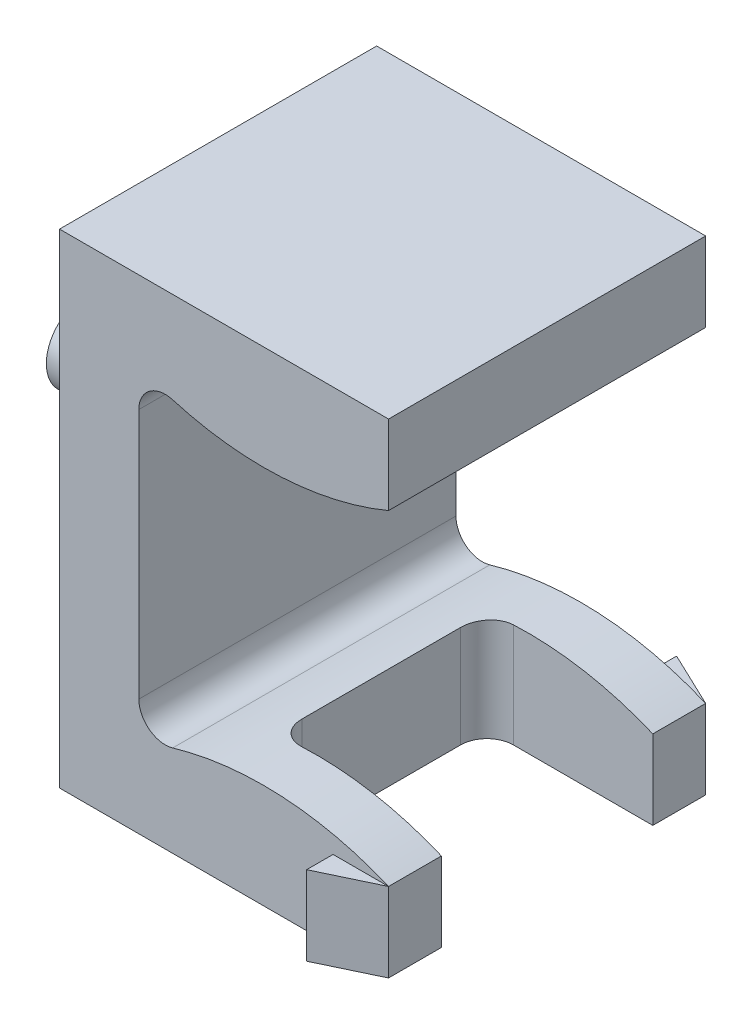
ISO-10303-21;
HEADER;
FILE_DESCRIPTION(('STEP AP214'),'2;1');
FILE_NAME('part.step','',(''),(''),'','','');
FILE_SCHEMA(('AUTOMOTIVE_DESIGN { 1 0 10303 214 1 1 1 1 }'));
ENDSEC;
DATA;
#1=APPLICATION_CONTEXT('core data for automotive mechanical design processes');
#2=APPLICATION_PROTOCOL_DEFINITION('international standard','automotive_design',2000,#1);
#3=PRODUCT_CONTEXT('',#1,'mechanical');
#4=PRODUCT('Part','Part','',(#3));
#5=PRODUCT_RELATED_PRODUCT_CATEGORY('part','',(#4));
#6=PRODUCT_DEFINITION_FORMATION('','',#4);
#7=PRODUCT_DEFINITION_CONTEXT('part definition',#1,'design');
#8=PRODUCT_DEFINITION('design','',#6,#7);
#9=PRODUCT_DEFINITION_SHAPE('','',#8);
#10=(LENGTH_UNIT() NAMED_UNIT(*) SI_UNIT(.MILLI.,.METRE.));
#11=(NAMED_UNIT(*) PLANE_ANGLE_UNIT() SI_UNIT($,.RADIAN.));
#12=(NAMED_UNIT(*) SI_UNIT($,.STERADIAN.) SOLID_ANGLE_UNIT());
#13=UNCERTAINTY_MEASURE_WITH_UNIT(LENGTH_MEASURE(1.E-05),#10,'distance_accuracy_value','');
#14=(GEOMETRIC_REPRESENTATION_CONTEXT(3) GLOBAL_UNCERTAINTY_ASSIGNED_CONTEXT((#13)) GLOBAL_UNIT_ASSIGNED_CONTEXT((#10,
#11,#12)) REPRESENTATION_CONTEXT('',''));
#15=CARTESIAN_POINT('',(0.,0.,0.));
#16=DIRECTION('',(0.,0.,1.));
#17=DIRECTION('',(1.,0.,0.));
#18=AXIS2_PLACEMENT_3D('',#15,#16,#17);
#19=CARTESIAN_POINT('',(-159.798174106342,-6.159375,6.));
#20=DIRECTION('',(-1.,0.,0.));
#21=DIRECTION('',(0.,-1.,0.));
#22=AXIS2_PLACEMENT_3D('',#19,#20,#21);
#23=PLANE('',#22);
#24=DIRECTION('',(0.,0.,-1.));
#25=VECTOR('',#24,1.);
#26=CARTESIAN_POINT('',(-159.798174106342,-9.159375,6.));
#27=LINE('',#26,#25);
#28=CARTESIAN_POINT('',(-159.798174106342,-9.159375,6.));
#29=VERTEX_POINT('',#28);
#30=CARTESIAN_POINT('',(-159.798174106342,-9.159375,4.));
#31=VERTEX_POINT('',#30);
#32=EDGE_CURVE('E199',#29,#31,#27,.T.);
#33=ORIENTED_EDGE('',*,*,#32,.T.);
#34=DIRECTION('',(0.,-1.,0.));
#35=VECTOR('',#34,1.);
#36=CARTESIAN_POINT('',(-159.798174106342,9.16037500000001,4.));
#37=LINE('',#36,#35);
#38=CARTESIAN_POINT('',(-159.798174106342,-6.159375,4.));
#39=VERTEX_POINT('',#38);
#40=EDGE_CURVE('E191',#39,#31,#37,.T.);
#41=ORIENTED_EDGE('',*,*,#40,.F.);
#42=DIRECTION('',(0.,0.,-1.));
#43=VECTOR('',#42,1.);
#44=CARTESIAN_POINT('',(-159.798174106342,-6.159375,6.));
#45=LINE('',#44,#43);
#46=CARTESIAN_POINT('',(-159.798174106342,-6.159375,6.));
#47=VERTEX_POINT('',#46);
#48=EDGE_CURVE('E200',#47,#39,#45,.T.);
#49=ORIENTED_EDGE('',*,*,#48,.F.);
#50=DIRECTION('',(0.,1.,0.));
#51=VECTOR('',#50,1.);
#52=CARTESIAN_POINT('',(-159.798174106342,-6.159375,6.));
#53=LINE('',#52,#51);
#54=EDGE_CURVE('E369',#29,#47,#53,.T.);
#55=ORIENTED_EDGE('',*,*,#54,.F.);
#56=EDGE_LOOP('',(#33,#41,#49,#55));
#57=FACE_BOUND('',#56,.T.);
#58=ADVANCED_FACE('F33',(#57),#23,.F.);
#59=CARTESIAN_POINT('',(-164.523174106342,17.4347039473684,6.));
#60=DIRECTION('',(0.,0.,-1.));
#61=DIRECTION('',(-1.,0.,0.));
#62=AXIS2_PLACEMENT_3D('',#59,#60,#61);
#63=CYLINDRICAL_SURFACE('',#62,12.2253289473684);
#64=CARTESIAN_POINT('',(-164.523174106342,17.4347039473684,6.));
#65=DIRECTION('',(0.,0.,1.));
#66=DIRECTION('',(1.,0.,0.));
#67=AXIS2_PLACEMENT_3D('',#64,#65,#66);
#68=CIRCLE('',#67,12.2253289473684);
#69=CARTESIAN_POINT('',(-167.966517595958,5.70431377977871,6.));
#70=VERTEX_POINT('',#69);
#71=CARTESIAN_POINT('',(-159.798174106342,6.159375,6.));
#72=VERTEX_POINT('',#71);
#73=EDGE_CURVE('E353',#70,#72,#68,.T.);
#74=ORIENTED_EDGE('',*,*,#73,.F.);
#75=DIRECTION('',(0.,0.,-1.));
#76=VECTOR('',#75,1.);
#77=CARTESIAN_POINT('',(-167.966517595958,5.70431377977872,6.));
#78=LINE('',#77,#76);
#79=CARTESIAN_POINT('',(-167.966517595958,5.70431377977871,-6.));
#80=VERTEX_POINT('',#79);
#81=EDGE_CURVE('E270',#70,#80,#78,.T.);
#82=ORIENTED_EDGE('',*,*,#81,.T.);
#83=CARTESIAN_POINT('',(-164.523174106342,17.4347039473684,-6.));
#84=DIRECTION('',(0.,0.,1.));
#85=DIRECTION('',(1.,0.,0.));
#86=AXIS2_PLACEMENT_3D('',#83,#84,#85);
#87=CIRCLE('',#86,12.2253289473684);
#88=CARTESIAN_POINT('',(-159.798174106342,6.159375,-6.));
#89=VERTEX_POINT('',#88);
#90=EDGE_CURVE('E331',#80,#89,#87,.T.);
#91=ORIENTED_EDGE('',*,*,#90,.T.);
#92=DIRECTION('',(0.,0.,-1.));
#93=VECTOR('',#92,1.);
#94=CARTESIAN_POINT('',(-159.798174106342,6.159375,6.));
#95=LINE('',#94,#93);
#96=EDGE_CURVE('E216',#72,#89,#95,.T.);
#97=ORIENTED_EDGE('',*,*,#96,.F.);
#98=EDGE_LOOP('',(#74,#82,#91,#97));
#99=FACE_BOUND('',#98,.T.);
#100=ADVANCED_FACE('F250',(#99),#63,.T.);
#101=CARTESIAN_POINT('',(-159.798174106342,6.159375,6.));
#102=DIRECTION('',(-1.,0.,0.));
#103=DIRECTION('',(0.,-1.,0.));
#104=AXIS2_PLACEMENT_3D('',#101,#102,#103);
#105=PLANE('',#104);
#106=DIRECTION('',(0.,1.,0.));
#107=VECTOR('',#106,1.);
#108=CARTESIAN_POINT('',(-159.798174106342,6.159375,-6.));
#109=LINE('',#108,#107);
#110=CARTESIAN_POINT('',(-159.798174106342,9.159375,-6.));
#111=VERTEX_POINT('',#110);
#112=EDGE_CURVE('E323',#89,#111,#109,.T.);
#113=ORIENTED_EDGE('',*,*,#112,.T.);
#114=DIRECTION('',(0.,0.,-1.));
#115=VECTOR('',#114,1.);
#116=CARTESIAN_POINT('',(-159.798174106342,9.159375,6.));
#117=LINE('',#116,#115);
#118=CARTESIAN_POINT('',(-159.798174106342,9.159375,6.));
#119=VERTEX_POINT('',#118);
#120=EDGE_CURVE('E213',#119,#111,#117,.T.);
#121=ORIENTED_EDGE('',*,*,#120,.F.);
#122=DIRECTION('',(0.,1.,0.));
#123=VECTOR('',#122,1.);
#124=CARTESIAN_POINT('',(-159.798174106342,6.159375,6.));
#125=LINE('',#124,#123);
#126=EDGE_CURVE('E356',#72,#119,#125,.T.);
#127=ORIENTED_EDGE('',*,*,#126,.F.);
#128=ORIENTED_EDGE('',*,*,#96,.T.);
#129=EDGE_LOOP('',(#113,#121,#127,#128));
#130=FACE_BOUND('',#129,.T.);
#131=ADVANCED_FACE('F297',(#130),#105,.F.);
#132=CARTESIAN_POINT('',(-159.798174106342,9.159375,6.));
#133=DIRECTION('',(0.,-1.,0.));
#134=DIRECTION('',(1.,0.,0.));
#135=AXIS2_PLACEMENT_3D('',#132,#133,#134);
#136=PLANE('',#135);
#137=DIRECTION('',(-1.,0.,0.));
#138=VECTOR('',#137,1.);
#139=CARTESIAN_POINT('',(-159.798174106342,9.159375,-6.));
#140=LINE('',#139,#138);
#141=CARTESIAN_POINT('',(-172.248174106342,9.159375,-6.));
#142=VERTEX_POINT('',#141);
#143=EDGE_CURVE('E330',#111,#142,#140,.T.);
#144=ORIENTED_EDGE('',*,*,#143,.T.);
#145=DIRECTION('',(0.,0.,-1.));
#146=VECTOR('',#145,1.);
#147=CARTESIAN_POINT('',(-172.248174106342,9.159375,6.));
#148=LINE('',#147,#146);
#149=CARTESIAN_POINT('',(-172.248174106342,9.159375,6.));
#150=VERTEX_POINT('',#149);
#151=EDGE_CURVE('E210',#150,#142,#148,.T.);
#152=ORIENTED_EDGE('',*,*,#151,.F.);
#153=DIRECTION('',(-1.,0.,0.));
#154=VECTOR('',#153,1.);
#155=CARTESIAN_POINT('',(-159.798174106342,9.159375,6.));
#156=LINE('',#155,#154);
#157=EDGE_CURVE('E334',#119,#150,#156,.T.);
#158=ORIENTED_EDGE('',*,*,#157,.F.);
#159=ORIENTED_EDGE('',*,*,#120,.T.);
#160=EDGE_LOOP('',(#144,#152,#158,#159));
#161=FACE_BOUND('',#160,.T.);
#162=ADVANCED_FACE('F311',(#161),#136,.F.);
#163=CARTESIAN_POINT('',(-172.248174106342,9.159375,6.));
#164=DIRECTION('',(1.,0.,0.));
#165=DIRECTION('',(0.,0.,-1.));
#166=AXIS2_PLACEMENT_3D('',#163,#164,#165);
#167=PLANE('',#166);
#168=CARTESIAN_POINT('',(-172.248174106342,0.,0.));
#169=DIRECTION('',(1.,0.,0.));
#170=DIRECTION('',(0.,0.,-1.));
#171=AXIS2_PLACEMENT_3D('',#168,#169,#170);
#172=CIRCLE('',#171,2.5);
#173=CARTESIAN_POINT('',(-172.248174106342,0.,-2.5));
#174=VERTEX_POINT('',#173);
#175=EDGE_CURVE('E11',#174,#174,#172,.T.);
#176=ORIENTED_EDGE('',*,*,#175,.T.);
#177=EDGE_LOOP('',(#176));
#178=FACE_BOUND('',#177,.T.);
#179=DIRECTION('',(0.,-1.,0.));
#180=VECTOR('',#179,1.);
#181=CARTESIAN_POINT('',(-172.248174106342,9.159375,-6.));
#182=LINE('',#181,#180);
#183=CARTESIAN_POINT('',(-172.248174106342,-9.159375,-6.));
#184=VERTEX_POINT('',#183);
#185=EDGE_CURVE('E339',#142,#184,#182,.T.);
#186=ORIENTED_EDGE('',*,*,#185,.T.);
#187=DIRECTION('',(0.,0.,-1.));
#188=VECTOR('',#187,1.);
#189=CARTESIAN_POINT('',(-172.248174106342,-9.159375,6.));
#190=LINE('',#189,#188);
#191=CARTESIAN_POINT('',(-172.248174106342,-9.159375,6.));
#192=VERTEX_POINT('',#191);
#193=EDGE_CURVE('E203',#192,#184,#190,.T.);
#194=ORIENTED_EDGE('',*,*,#193,.F.);
#195=DIRECTION('',(0.,-1.,0.));
#196=VECTOR('',#195,1.);
#197=CARTESIAN_POINT('',(-172.248174106342,9.159375,6.));
#198=LINE('',#197,#196);
#199=EDGE_CURVE('E364',#150,#192,#198,.T.);
#200=ORIENTED_EDGE('',*,*,#199,.F.);
#201=ORIENTED_EDGE('',*,*,#151,.T.);
#202=EDGE_LOOP('',(#186,#194,#200,#201));
#203=FACE_BOUND('',#202,.T.);
#204=ADVANCED_FACE('F307',(#178,#203),#167,.F.);
#205=CARTESIAN_POINT('',(-159.798174106342,-9.159375,6.));
#206=DIRECTION('',(0.,1.,0.));
#207=DIRECTION('',(-1.,0.,0.));
#208=AXIS2_PLACEMENT_3D('',#205,#206,#207);
#209=PLANE('',#208);
#210=DIRECTION('',(0.,0.,-1.));
#211=VECTOR('',#210,1.);
#212=CARTESIAN_POINT('',(-166.073174106342,-9.159375,4.));
#213=LINE('',#212,#211);
#214=CARTESIAN_POINT('',(-166.073174106342,-9.159375,3.));
#215=VERTEX_POINT('',#214);
#216=CARTESIAN_POINT('',(-166.073174106342,-9.159375,-3.));
#217=VERTEX_POINT('',#216);
#218=EDGE_CURVE('E182',#215,#217,#213,.T.);
#219=ORIENTED_EDGE('',*,*,#218,.F.);
#220=CARTESIAN_POINT('',(-165.073174106342,-9.159375,3.));
#221=DIRECTION('',(0.,1.,0.));
#222=DIRECTION('',(-1.,0.,0.));
#223=AXIS2_PLACEMENT_3D('',#220,#221,#222);
#224=CIRCLE('',#223,1.);
#225=CARTESIAN_POINT('',(-165.073174106342,-9.159375,4.));
#226=VERTEX_POINT('',#225);
#227=EDGE_CURVE('E237',#215,#226,#224,.T.);
#228=ORIENTED_EDGE('',*,*,#227,.T.);
#229=DIRECTION('',(-1.,0.,0.));
#230=VECTOR('',#229,1.);
#231=CARTESIAN_POINT('',(-159.798174106342,-9.159375,4.));
#232=LINE('',#231,#230);
#233=EDGE_CURVE('E419',#31,#226,#232,.T.);
#234=ORIENTED_EDGE('',*,*,#233,.F.);
#235=ORIENTED_EDGE('',*,*,#32,.F.);
#236=DIRECTION('',(-0.902860518823943,0.,0.429933580392322));
#237=VECTOR('',#236,1.);
#238=CARTESIAN_POINT('',(-159.798174106342,-9.159375,6.));
#239=LINE('',#238,#237);
#240=CARTESIAN_POINT('',(-161.898174106342,-9.159375,7.));
#241=VERTEX_POINT('',#240);
#242=EDGE_CURVE('E397',#29,#241,#239,.T.);
#243=ORIENTED_EDGE('',*,*,#242,.T.);
#244=DIRECTION('',(0.,0.,-1.));
#245=VECTOR('',#244,1.);
#246=CARTESIAN_POINT('',(-161.898174106342,-9.159375,7.));
#247=LINE('',#246,#245);
#248=CARTESIAN_POINT('',(-161.898174106342,-9.159375,6.));
#249=VERTEX_POINT('',#248);
#250=EDGE_CURVE('E401',#241,#249,#247,.T.);
#251=ORIENTED_EDGE('',*,*,#250,.T.);
#252=DIRECTION('',(1.,0.,0.));
#253=VECTOR('',#252,1.);
#254=CARTESIAN_POINT('',(-159.798174106342,-9.159375,6.));
#255=LINE('',#254,#253);
#256=EDGE_CURVE('E366',#192,#249,#255,.T.);
#257=ORIENTED_EDGE('',*,*,#256,.F.);
#258=ORIENTED_EDGE('',*,*,#193,.T.);
#259=DIRECTION('',(1.,0.,0.));
#260=VECTOR('',#259,1.);
#261=CARTESIAN_POINT('',(-159.798174106342,-9.159375,-6.));
#262=LINE('',#261,#260);
#263=CARTESIAN_POINT('',(-161.898174106342,-9.159375,-6.));
#264=VERTEX_POINT('',#263);
#265=EDGE_CURVE('E341',#184,#264,#262,.T.);
#266=ORIENTED_EDGE('',*,*,#265,.T.);
#267=DIRECTION('',(0.,0.,-1.));
#268=VECTOR('',#267,1.);
#269=CARTESIAN_POINT('',(-161.898174106342,-9.159375,-7.));
#270=LINE('',#269,#268);
#271=CARTESIAN_POINT('',(-161.898174106342,-9.159375,-7.));
#272=VERTEX_POINT('',#271);
#273=EDGE_CURVE('E384',#264,#272,#270,.T.);
#274=ORIENTED_EDGE('',*,*,#273,.T.);
#275=DIRECTION('',(0.902860518823943,0.,0.429933580392322));
#276=VECTOR('',#275,1.);
#277=CARTESIAN_POINT('',(-159.798174106342,-9.159375,-6.));
#278=LINE('',#277,#276);
#279=CARTESIAN_POINT('',(-159.798174106342,-9.159375,-6.));
#280=VERTEX_POINT('',#279);
#281=EDGE_CURVE('E198',#272,#280,#278,.T.);
#282=ORIENTED_EDGE('',*,*,#281,.T.);
#283=CARTESIAN_POINT('',(-159.798174106342,-9.159375,-4.));
#284=VERTEX_POINT('',#283);
#285=EDGE_CURVE('E188',#284,#280,#27,.T.);
#286=ORIENTED_EDGE('',*,*,#285,.F.);
#287=DIRECTION('',(1.,0.,0.));
#288=VECTOR('',#287,1.);
#289=CARTESIAN_POINT('',(-159.798174106342,-9.159375,-4.));
#290=LINE('',#289,#288);
#291=CARTESIAN_POINT('',(-165.073174106342,-9.159375,-4.));
#292=VERTEX_POINT('',#291);
#293=EDGE_CURVE('E172',#292,#284,#290,.T.);
#294=ORIENTED_EDGE('',*,*,#293,.F.);
#295=CARTESIAN_POINT('',(-165.073174106342,-9.159375,-3.));
#296=DIRECTION('',(0.,1.,0.));
#297=DIRECTION('',(-1.,0.,0.));
#298=AXIS2_PLACEMENT_3D('',#295,#296,#297);
#299=CIRCLE('',#298,1.);
#300=EDGE_CURVE('E227',#292,#217,#299,.T.);
#301=ORIENTED_EDGE('',*,*,#300,.T.);
#302=EDGE_LOOP('',(#219,#228,#234,#235,#243,#251,#257,#258,#266,#274,#282,#286,#294,#301));
#303=FACE_BOUND('',#302,.T.);
#304=ADVANCED_FACE('F195',(#303),#209,.F.);
#305=CARTESIAN_POINT('',(-159.798174106342,-6.159375,-4.));
#306=VERTEX_POINT('',#305);
#307=CARTESIAN_POINT('',(-159.798174106342,-6.159375,-6.));
#308=VERTEX_POINT('',#307);
#309=EDGE_CURVE('E190',#306,#308,#45,.T.);
#310=ORIENTED_EDGE('',*,*,#309,.F.);
#311=DIRECTION('',(0.,-1.,0.));
#312=VECTOR('',#311,1.);
#313=CARTESIAN_POINT('',(-159.798174106342,9.16037500000001,-4.));
#314=LINE('',#313,#312);
#315=EDGE_CURVE('E176',#306,#284,#314,.T.);
#316=ORIENTED_EDGE('',*,*,#315,.T.);
#317=ORIENTED_EDGE('',*,*,#285,.T.);
#318=DIRECTION('',(0.,1.,0.));
#319=VECTOR('',#318,1.);
#320=CARTESIAN_POINT('',(-159.798174106342,-6.159375,-6.));
#321=LINE('',#320,#319);
#322=EDGE_CURVE('E347',#280,#308,#321,.T.);
#323=ORIENTED_EDGE('',*,*,#322,.T.);
#324=EDGE_LOOP('',(#310,#316,#317,#323));
#325=FACE_BOUND('',#324,.T.);
#326=ADVANCED_FACE('F186',(#325),#23,.F.);
#327=CARTESIAN_POINT('',(-164.523174106342,-17.4347039473684,6.));
#328=DIRECTION('',(0.,0.,-1.));
#329=DIRECTION('',(-1.,0.,0.));
#330=AXIS2_PLACEMENT_3D('',#327,#328,#329);
#331=CYLINDRICAL_SURFACE('',#330,12.2253289473684);
#332=CARTESIAN_POINT('',(-164.523174106342,-17.4347039473684,-6.));
#333=DIRECTION('',(0.,0.,1.));
#334=DIRECTION('',(-1.,0.,0.));
#335=AXIS2_PLACEMENT_3D('',#332,#333,#334);
#336=CIRCLE('',#335,12.2253289473684);
#337=CARTESIAN_POINT('',(-167.966517595958,-5.70431377977871,-6.));
#338=VERTEX_POINT('',#337);
#339=EDGE_CURVE('E349',#308,#338,#336,.T.);
#340=ORIENTED_EDGE('',*,*,#339,.T.);
#341=DIRECTION('',(0.,0.,-1.));
#342=VECTOR('',#341,1.);
#343=CARTESIAN_POINT('',(-167.966517595958,-5.70431377977871,6.));
#344=LINE('',#343,#342);
#345=CARTESIAN_POINT('',(-167.966517595958,-5.70431377977871,6.));
#346=VERTEX_POINT('',#345);
#347=EDGE_CURVE('E268',#338,#346,#344,.F.);
#348=ORIENTED_EDGE('',*,*,#347,.T.);
#349=CARTESIAN_POINT('',(-164.523174106342,-17.4347039473684,6.));
#350=DIRECTION('',(0.,0.,1.));
#351=DIRECTION('',(-1.,0.,0.));
#352=AXIS2_PLACEMENT_3D('',#349,#350,#351);
#353=CIRCLE('',#352,12.2253289473684);
#354=EDGE_CURVE('E372',#47,#346,#353,.T.);
#355=ORIENTED_EDGE('',*,*,#354,.F.);
#356=ORIENTED_EDGE('',*,*,#48,.T.);
#357=CARTESIAN_POINT('',(-164.523174106342,-17.4347039473684,4.));
#358=DIRECTION('',(0.,0.,1.));
#359=DIRECTION('',(1.,0.,0.));
#360=AXIS2_PLACEMENT_3D('',#357,#358,#359);
#361=CIRCLE('',#360,12.2253289473684);
#362=CARTESIAN_POINT('',(-165.073174106342,-5.22175312165212,4.));
#363=VERTEX_POINT('',#362);
#364=EDGE_CURVE('E415',#363,#39,#361,.F.);
#365=ORIENTED_EDGE('',*,*,#364,.F.);
#366=CARTESIAN_POINT('',(-165.073174106342,-5.22175312165212,4.));
#367=CARTESIAN_POINT('',(-165.101346268109,-5.22302128326824,3.99999985398283));
#368=CARTESIAN_POINT('',(-165.129500277017,-5.22438752350859,3.9988087613292));
#369=CARTESIAN_POINT('',(-165.185596334637,-5.22730243965531,3.99405951774266));
#370=CARTESIAN_POINT('',(-165.21353839878,-5.22885110214067,3.99050154085457));
#371=CARTESIAN_POINT('',(-165.296689148629,-5.23374454311536,3.97631638140692));
#372=CARTESIAN_POINT('',(-165.351325472437,-5.2373414584627,3.96217784757077));
#373=CARTESIAN_POINT('',(-165.457411353878,-5.24500720670226,3.92494730148958));
#374=CARTESIAN_POINT('',(-165.508859758329,-5.2490762088533,3.90185207097535));
#375=CARTESIAN_POINT('',(-165.607142198487,-5.25742535511839,3.84736821729734));
#376=CARTESIAN_POINT('',(-165.653976691522,-5.26170547824297,3.81598041722729));
#377=CARTESIAN_POINT('',(-165.74185057136,-5.27018775864954,3.74568604369554));
#378=CARTESIAN_POINT('',(-165.782872455346,-5.27438964869004,3.70675756339565));
#379=CARTESIAN_POINT('',(-165.857806007102,-5.28238527380936,3.62251934698116));
#380=CARTESIAN_POINT('',(-165.891716389361,-5.28617893503448,3.57720845962119));
#381=CARTESIAN_POINT('',(-165.95142012606,-5.29305303051908,3.48152165493301));
#382=CARTESIAN_POINT('',(-165.977219157732,-5.29613396322502,3.43114931290939));
#383=CARTESIAN_POINT('',(-166.01996441327,-5.30133041166867,3.32674809592896));
#384=CARTESIAN_POINT('',(-166.036916530285,-5.30344656994752,3.27272168220721));
#385=CARTESIAN_POINT('',(-166.057162996814,-5.30599379262529,3.18195604211685));
#386=CARTESIAN_POINT('',(-166.063162834044,-5.30675562681737,3.14580663866345));
#387=CARTESIAN_POINT('',(-166.071168129958,-5.30777576602485,3.07311019074521));
#388=CARTESIAN_POINT('',(-166.073178901571,-5.30803474077535,3.03656374045546));
#389=CARTESIAN_POINT('',(-166.073174106342,-5.30803219163244,3.));
#390=B_SPLINE_CURVE_WITH_KNOTS('',3,(#366,#367,#368,#369,#370,#371,#372,#373,#374,#375,#376,
#377,#378,#379,#380,#381,#382,#383,#384,#385,#386,#387,#388,#389),.UNSPECIFIED.,.F.,.F.,(4,2,2,
2,2,2,2,2,2,2,2,4),(0.,0.0845496261692513,0.169093035811907,0.337874249857301,0.506716165678873,
0.675541329087885,0.844864517728208,1.01421828773889,1.18345325976219,1.35257535580826,
1.46232316407268,1.5719247038028),.UNSPECIFIED.);
#391=CARTESIAN_POINT('',(-166.073174106342,-5.30803219163244,3.));
#392=VERTEX_POINT('',#391);
#393=EDGE_CURVE('E257',#363,#392,#390,.T.);
#394=ORIENTED_EDGE('',*,*,#393,.T.);
#395=DIRECTION('',(0.,0.,-1.));
#396=VECTOR('',#395,1.);
#397=CARTESIAN_POINT('',(-166.073174106342,-5.30803219163244,6.));
#398=LINE('',#397,#396);
#399=CARTESIAN_POINT('',(-166.073174106342,-5.30803219163244,-3.));
#400=VERTEX_POINT('',#399);
#401=EDGE_CURVE('E412',#400,#392,#398,.F.);
#402=ORIENTED_EDGE('',*,*,#401,.F.);
#403=CARTESIAN_POINT('',(-166.073174106342,-5.30803219163244,-3.));
#404=CARTESIAN_POINT('',(-166.073174049363,-5.30803274762171,-3.0279996811053));
#405=CARTESIAN_POINT('',(-166.071997389589,-5.30788172420739,-3.05598585616327));
#406=CARTESIAN_POINT('',(-166.067304073752,-5.30728300203892,-3.11175603063478));
#407=CARTESIAN_POINT('',(-166.063787588939,-5.30683532499659,-3.13954004469385));
#408=CARTESIAN_POINT('',(-166.049766186408,-5.30505931346649,-3.22222475021868));
#409=CARTESIAN_POINT('',(-166.035789200443,-5.3032979480999,-3.27656856195834));
#410=CARTESIAN_POINT('',(-165.99898094625,-5.29876551370159,-3.38211391301675));
#411=CARTESIAN_POINT('',(-165.976146495197,-5.29599408173604,-3.43331431511938));
#412=CARTESIAN_POINT('',(-165.922285465868,-5.28966842970327,-3.53115576681537));
#413=CARTESIAN_POINT('',(-165.891259491052,-5.28611426730205,-3.57779715191934));
#414=CARTESIAN_POINT('',(-165.821733480109,-5.27848592997923,-3.66543423257584));
#415=CARTESIAN_POINT('',(-165.783199411342,-5.27440941729784,-3.70640271021766));
#416=CARTESIAN_POINT('',(-165.699822591642,-5.26605907753409,-3.78131472876322));
#417=CARTESIAN_POINT('',(-165.654978495282,-5.26178520850219,-3.81525676766085));
#418=CARTESIAN_POINT('',(-165.559965744755,-5.25332403476427,-3.87533562790452));
#419=CARTESIAN_POINT('',(-165.509767829225,-5.24913737271897,-3.90142622913465));
#420=CARTESIAN_POINT('',(-165.405680814164,-5.24115784163623,-3.94478192061627));
#421=CARTESIAN_POINT('',(-165.351793950138,-5.23736473754784,-3.96205230316862));
#422=CARTESIAN_POINT('',(-165.260192126413,-5.23155581589301,-3.98307765701795));
#423=CARTESIAN_POINT('',(-165.223060759006,-5.22936852402431,-3.98941748583722));
#424=CARTESIAN_POINT('',(-165.1483524309,-5.22531278498121,-3.99787860508363));
#425=CARTESIAN_POINT('',(-165.110776109942,-5.22344392832393,-4.0000053512021));
#426=CARTESIAN_POINT('',(-165.073174106342,-5.22175312165212,-4.));
#427=B_SPLINE_CURVE_WITH_KNOTS('',3,(#403,#404,#405,#406,#407,#408,#409,#410,#411,#412,#413,
#414,#415,#416,#417,#418,#419,#420,#421,#422,#423,#424,#425,#426),.UNSPECIFIED.,.F.,.F.,(4,2,2,
2,2,2,2,2,2,2,2,4),(0.,0.0839471466802029,0.167888150019918,0.33544302684374,0.503058168390663,
0.670660965376114,0.83904192849541,1.00745884847409,1.17684864318093,1.3461366809896,
1.4591087284746,1.57193438800425),.UNSPECIFIED.);
#428=CARTESIAN_POINT('',(-165.073174106342,-5.22175312165212,-4.));
#429=VERTEX_POINT('',#428);
#430=EDGE_CURVE('E229',#400,#429,#427,.T.);
#431=ORIENTED_EDGE('',*,*,#430,.T.);
#432=CARTESIAN_POINT('',(-164.523174106342,-17.4347039473684,-4.));
#433=DIRECTION('',(0.,0.,-1.));
#434=DIRECTION('',(-1.,0.,0.));
#435=AXIS2_PLACEMENT_3D('',#432,#433,#434);
#436=CIRCLE('',#435,12.2253289473684);
#437=EDGE_CURVE('E416',#306,#429,#436,.F.);
#438=ORIENTED_EDGE('',*,*,#437,.F.);
#439=ORIENTED_EDGE('',*,*,#309,.T.);
#440=EDGE_LOOP('',(#340,#348,#355,#356,#365,#394,#402,#431,#438,#439));
#441=FACE_BOUND('',#440,.T.);
#442=ADVANCED_FACE('F239',(#441),#331,.T.);
#443=CARTESIAN_POINT('',(-169.248174106342,6.159375,6.));
#444=DIRECTION('',(-1.,0.,0.));
#445=DIRECTION('',(0.,0.,1.));
#446=AXIS2_PLACEMENT_3D('',#443,#444,#445);
#447=PLANE('',#446);
#448=DIRECTION('',(0.,1.,0.));
#449=VECTOR('',#448,1.);
#450=CARTESIAN_POINT('',(-169.248174106342,-6.159375,6.));
#451=LINE('',#450,#449);
#452=CARTESIAN_POINT('',(-169.248174106342,-4.74479848018305,6.));
#453=VERTEX_POINT('',#452);
#454=CARTESIAN_POINT('',(-169.248174106342,4.74479848018306,6.));
#455=VERTEX_POINT('',#454);
#456=EDGE_CURVE('E375',#453,#455,#451,.T.);
#457=ORIENTED_EDGE('',*,*,#456,.F.);
#458=DIRECTION('',(0.,0.,1.));
#459=VECTOR('',#458,1.);
#460=CARTESIAN_POINT('',(-169.248174106342,-4.74479848018305,-6.));
#461=LINE('',#460,#459);
#462=CARTESIAN_POINT('',(-169.248174106342,-4.74479848018305,-6.));
#463=VERTEX_POINT('',#462);
#464=EDGE_CURVE('E265',#453,#463,#461,.F.);
#465=ORIENTED_EDGE('',*,*,#464,.T.);
#466=DIRECTION('',(0.,1.,0.));
#467=VECTOR('',#466,1.);
#468=CARTESIAN_POINT('',(-169.248174106342,6.159375,-6.));
#469=LINE('',#468,#467);
#470=CARTESIAN_POINT('',(-169.248174106342,4.74479848018305,-6.));
#471=VERTEX_POINT('',#470);
#472=EDGE_CURVE('E351',#463,#471,#469,.T.);
#473=ORIENTED_EDGE('',*,*,#472,.T.);
#474=DIRECTION('',(0.,0.,1.));
#475=VECTOR('',#474,1.);
#476=CARTESIAN_POINT('',(-169.248174106342,4.74479848018305,6.));
#477=LINE('',#476,#475);
#478=EDGE_CURVE('E263',#471,#455,#477,.T.);
#479=ORIENTED_EDGE('',*,*,#478,.T.);
#480=EDGE_LOOP('',(#457,#465,#473,#479));
#481=FACE_BOUND('',#480,.T.);
#482=ADVANCED_FACE('F305',(#481),#447,.F.);
#483=CARTESIAN_POINT('',(-164.523174106342,17.4347039473684,6.));
#484=DIRECTION('',(0.,0.,1.));
#485=DIRECTION('',(1.,0.,0.));
#486=AXIS2_PLACEMENT_3D('',#483,#484,#485);
#487=PLANE('',#486);
#488=DIRECTION('',(0.,-1.,0.));
#489=VECTOR('',#488,1.);
#490=CARTESIAN_POINT('',(-161.898174106342,-6.159375,6.));
#491=LINE('',#490,#489);
#492=CARTESIAN_POINT('',(-161.898174106342,-6.159375,6.));
#493=VERTEX_POINT('',#492);
#494=EDGE_CURVE('E393',#493,#249,#491,.T.);
#495=ORIENTED_EDGE('',*,*,#494,.F.);
#496=DIRECTION('',(1.,0.,0.));
#497=VECTOR('',#496,1.);
#498=CARTESIAN_POINT('',(-161.898174106342,-6.159375,6.));
#499=LINE('',#498,#497);
#500=EDGE_CURVE('E406',#493,#47,#499,.T.);
#501=ORIENTED_EDGE('',*,*,#500,.T.);
#502=ORIENTED_EDGE('',*,*,#354,.T.);
#503=CARTESIAN_POINT('',(-168.248174106342,-4.74479848018305,6.));
#504=DIRECTION('',(0.,0.,1.));
#505=DIRECTION('',(1.,0.,0.));
#506=AXIS2_PLACEMENT_3D('',#503,#504,#505);
#507=CIRCLE('',#506,1.);
#508=EDGE_CURVE('E274',#346,#453,#507,.F.);
#509=ORIENTED_EDGE('',*,*,#508,.T.);
#510=ORIENTED_EDGE('',*,*,#456,.T.);
#511=CARTESIAN_POINT('',(-168.248174106342,4.74479848018305,6.));
#512=DIRECTION('',(0.,0.,1.));
#513=DIRECTION('',(1.,0.,0.));
#514=AXIS2_PLACEMENT_3D('',#511,#512,#513);
#515=CIRCLE('',#514,1.);
#516=EDGE_CURVE('E48',#455,#70,#515,.F.);
#517=ORIENTED_EDGE('',*,*,#516,.T.);
#518=ORIENTED_EDGE('',*,*,#73,.T.);
#519=ORIENTED_EDGE('',*,*,#126,.T.);
#520=ORIENTED_EDGE('',*,*,#157,.T.);
#521=ORIENTED_EDGE('',*,*,#199,.T.);
#522=ORIENTED_EDGE('',*,*,#256,.T.);
#523=EDGE_LOOP('',(#495,#501,#502,#509,#510,#517,#518,#519,#520,#521,#522));
#524=FACE_BOUND('',#523,.T.);
#525=ADVANCED_FACE('F467',(#524),#487,.T.);
#526=CARTESIAN_POINT('',(-164.523174106342,17.4347039473684,-6.));
#527=DIRECTION('',(0.,0.,1.));
#528=DIRECTION('',(1.,0.,0.));
#529=AXIS2_PLACEMENT_3D('',#526,#527,#528);
#530=PLANE('',#529);
#531=ORIENTED_EDGE('',*,*,#339,.F.);
#532=DIRECTION('',(-1.,0.,0.));
#533=VECTOR('',#532,1.);
#534=CARTESIAN_POINT('',(-161.898174106342,-6.159375,-6.));
#535=LINE('',#534,#533);
#536=CARTESIAN_POINT('',(-161.898174106342,-6.159375,-6.));
#537=VERTEX_POINT('',#536);
#538=EDGE_CURVE('E383',#308,#537,#535,.T.);
#539=ORIENTED_EDGE('',*,*,#538,.T.);
#540=DIRECTION('',(0.,-1.,0.));
#541=VECTOR('',#540,1.);
#542=CARTESIAN_POINT('',(-161.898174106342,-6.159375,-6.));
#543=LINE('',#542,#541);
#544=EDGE_CURVE('E360',#537,#264,#543,.T.);
#545=ORIENTED_EDGE('',*,*,#544,.T.);
#546=ORIENTED_EDGE('',*,*,#265,.F.);
#547=ORIENTED_EDGE('',*,*,#185,.F.);
#548=ORIENTED_EDGE('',*,*,#143,.F.);
#549=ORIENTED_EDGE('',*,*,#112,.F.);
#550=ORIENTED_EDGE('',*,*,#90,.F.);
#551=CARTESIAN_POINT('',(-168.248174106342,4.74479848018305,-6.));
#552=DIRECTION('',(0.,0.,1.));
#553=DIRECTION('',(1.,0.,0.));
#554=AXIS2_PLACEMENT_3D('',#551,#552,#553);
#555=CIRCLE('',#554,1.);
#556=EDGE_CURVE('E56',#80,#471,#555,.T.);
#557=ORIENTED_EDGE('',*,*,#556,.T.);
#558=ORIENTED_EDGE('',*,*,#472,.F.);
#559=CARTESIAN_POINT('',(-168.248174106342,-4.74479848018305,-6.));
#560=DIRECTION('',(0.,0.,1.));
#561=DIRECTION('',(1.,0.,0.));
#562=AXIS2_PLACEMENT_3D('',#559,#560,#561);
#563=CIRCLE('',#562,1.);
#564=EDGE_CURVE('E272',#463,#338,#563,.T.);
#565=ORIENTED_EDGE('',*,*,#564,.T.);
#566=EDGE_LOOP('',(#531,#539,#545,#546,#547,#548,#549,#550,#557,#558,#565));
#567=FACE_BOUND('',#566,.T.);
#568=ADVANCED_FACE('F337',(#567),#530,.F.);
#569=CARTESIAN_POINT('',(-159.798174106342,-6.159375,-6.));
#570=DIRECTION('',(0.429933580392322,0.,-0.902860518823943));
#571=DIRECTION('',(-0.902860518823943,0.,-0.429933580392322));
#572=AXIS2_PLACEMENT_3D('',#569,#570,#571);
#573=PLANE('',#572);
#574=ORIENTED_EDGE('',*,*,#281,.F.);
#575=DIRECTION('',(0.,-1.,0.));
#576=VECTOR('',#575,1.);
#577=CARTESIAN_POINT('',(-161.898174106342,-6.159375,-7.));
#578=LINE('',#577,#576);
#579=CARTESIAN_POINT('',(-161.898174106342,-6.159375,-7.));
#580=VERTEX_POINT('',#579);
#581=EDGE_CURVE('E376',#580,#272,#578,.T.);
#582=ORIENTED_EDGE('',*,*,#581,.F.);
#583=DIRECTION('',(0.902860518823943,0.,0.429933580392322));
#584=VECTOR('',#583,1.);
#585=CARTESIAN_POINT('',(-159.798174106342,-6.159375,-6.));
#586=LINE('',#585,#584);
#587=EDGE_CURVE('E380',#580,#308,#586,.T.);
#588=ORIENTED_EDGE('',*,*,#587,.T.);
#589=ORIENTED_EDGE('',*,*,#322,.F.);
#590=EDGE_LOOP('',(#574,#582,#588,#589));
#591=FACE_BOUND('',#590,.T.);
#592=ADVANCED_FACE('F461',(#591),#573,.T.);
#593=CARTESIAN_POINT('',(-161.898174106342,-6.159375,-7.));
#594=DIRECTION('',(-1.,0.,0.));
#595=DIRECTION('',(0.,-1.,0.));
#596=AXIS2_PLACEMENT_3D('',#593,#594,#595);
#597=PLANE('',#596);
#598=ORIENTED_EDGE('',*,*,#273,.F.);
#599=ORIENTED_EDGE('',*,*,#544,.F.);
#600=DIRECTION('',(0.,0.,-1.));
#601=VECTOR('',#600,1.);
#602=CARTESIAN_POINT('',(-161.898174106342,-6.159375,-7.));
#603=LINE('',#602,#601);
#604=EDGE_CURVE('E389',#537,#580,#603,.T.);
#605=ORIENTED_EDGE('',*,*,#604,.T.);
#606=ORIENTED_EDGE('',*,*,#581,.T.);
#607=EDGE_LOOP('',(#598,#599,#605,#606));
#608=FACE_BOUND('',#607,.T.);
#609=ADVANCED_FACE('F459',(#608),#597,.T.);
#610=CARTESIAN_POINT('',(0.,-6.159375,0.));
#611=DIRECTION('',(0.,-1.,0.));
#612=DIRECTION('',(0.,0.,-1.));
#613=AXIS2_PLACEMENT_3D('',#610,#611,#612);
#614=PLANE('',#613);
#615=ORIENTED_EDGE('',*,*,#538,.F.);
#616=ORIENTED_EDGE('',*,*,#587,.F.);
#617=ORIENTED_EDGE('',*,*,#604,.F.);
#618=EDGE_LOOP('',(#615,#616,#617));
#619=FACE_BOUND('',#618,.T.);
#620=ADVANCED_FACE('F455',(#619),#614,.F.);
#621=CARTESIAN_POINT('',(-161.898174106342,-6.159375,7.));
#622=DIRECTION('',(-1.,0.,0.));
#623=DIRECTION('',(0.,-1.,0.));
#624=AXIS2_PLACEMENT_3D('',#621,#622,#623);
#625=PLANE('',#624);
#626=ORIENTED_EDGE('',*,*,#250,.F.);
#627=DIRECTION('',(0.,-1.,0.));
#628=VECTOR('',#627,1.);
#629=CARTESIAN_POINT('',(-161.898174106342,-6.159375,7.));
#630=LINE('',#629,#628);
#631=CARTESIAN_POINT('',(-161.898174106342,-6.159375,7.));
#632=VERTEX_POINT('',#631);
#633=EDGE_CURVE('E386',#632,#241,#630,.T.);
#634=ORIENTED_EDGE('',*,*,#633,.F.);
#635=DIRECTION('',(0.,0.,-1.));
#636=VECTOR('',#635,1.);
#637=CARTESIAN_POINT('',(-161.898174106342,-6.159375,7.));
#638=LINE('',#637,#636);
#639=EDGE_CURVE('E400',#632,#493,#638,.T.);
#640=ORIENTED_EDGE('',*,*,#639,.T.);
#641=ORIENTED_EDGE('',*,*,#494,.T.);
#642=EDGE_LOOP('',(#626,#634,#640,#641));
#643=FACE_BOUND('',#642,.T.);
#644=ADVANCED_FACE('F451',(#643),#625,.T.);
#645=CARTESIAN_POINT('',(-159.798174106342,-6.159375,6.));
#646=DIRECTION('',(0.429933580392322,0.,0.902860518823943));
#647=DIRECTION('',(0.902860518823943,0.,-0.429933580392322));
#648=AXIS2_PLACEMENT_3D('',#645,#646,#647);
#649=PLANE('',#648);
#650=ORIENTED_EDGE('',*,*,#242,.F.);
#651=ORIENTED_EDGE('',*,*,#54,.T.);
#652=DIRECTION('',(-0.902860518823943,0.,0.429933580392322));
#653=VECTOR('',#652,1.);
#654=CARTESIAN_POINT('',(-159.798174106342,-6.159375,6.));
#655=LINE('',#654,#653);
#656=EDGE_CURVE('E395',#47,#632,#655,.T.);
#657=ORIENTED_EDGE('',*,*,#656,.T.);
#658=ORIENTED_EDGE('',*,*,#633,.T.);
#659=EDGE_LOOP('',(#650,#651,#657,#658));
#660=FACE_BOUND('',#659,.T.);
#661=ADVANCED_FACE('F447',(#660),#649,.T.);
#662=CARTESIAN_POINT('',(0.,-6.159375,0.));
#663=DIRECTION('',(0.,-1.,0.));
#664=DIRECTION('',(0.,0.,-1.));
#665=AXIS2_PLACEMENT_3D('',#662,#663,#664);
#666=PLANE('',#665);
#667=ORIENTED_EDGE('',*,*,#639,.F.);
#668=ORIENTED_EDGE('',*,*,#656,.F.);
#669=ORIENTED_EDGE('',*,*,#500,.F.);
#670=EDGE_LOOP('',(#667,#668,#669));
#671=FACE_BOUND('',#670,.T.);
#672=ADVANCED_FACE('F443',(#671),#666,.F.);
#673=CARTESIAN_POINT('',(-159.798174106342,9.16037500000001,4.));
#674=DIRECTION('',(0.,0.,1.));
#675=DIRECTION('',(1.,0.,0.));
#676=AXIS2_PLACEMENT_3D('',#673,#674,#675);
#677=PLANE('',#676);
#678=ORIENTED_EDGE('',*,*,#233,.T.);
#679=DIRECTION('',(0.,-1.,0.));
#680=VECTOR('',#679,1.);
#681=CARTESIAN_POINT('',(-165.073174106342,-5.30803219163244,4.));
#682=LINE('',#681,#680);
#683=EDGE_CURVE('E225',#226,#363,#682,.F.);
#684=ORIENTED_EDGE('',*,*,#683,.T.);
#685=ORIENTED_EDGE('',*,*,#364,.T.);
#686=ORIENTED_EDGE('',*,*,#40,.T.);
#687=EDGE_LOOP('',(#678,#684,#685,#686));
#688=FACE_BOUND('',#687,.T.);
#689=ADVANCED_FACE('F439',(#688),#677,.F.);
#690=CARTESIAN_POINT('',(-166.073174106342,9.16037500000001,4.));
#691=DIRECTION('',(-1.,0.,0.));
#692=DIRECTION('',(0.,-1.,0.));
#693=AXIS2_PLACEMENT_3D('',#690,#691,#692);
#694=PLANE('',#693);
#695=ORIENTED_EDGE('',*,*,#218,.T.);
#696=DIRECTION('',(0.,-1.,0.));
#697=VECTOR('',#696,1.);
#698=CARTESIAN_POINT('',(-166.073174106342,-5.30803219163244,-3.));
#699=LINE('',#698,#697);
#700=EDGE_CURVE('E223',#217,#400,#699,.F.);
#701=ORIENTED_EDGE('',*,*,#700,.T.);
#702=ORIENTED_EDGE('',*,*,#401,.T.);
#703=DIRECTION('',(0.,-1.,0.));
#704=VECTOR('',#703,1.);
#705=CARTESIAN_POINT('',(-166.073174106342,-9.159375,3.));
#706=LINE('',#705,#704);
#707=EDGE_CURVE('E220',#392,#215,#706,.T.);
#708=ORIENTED_EDGE('',*,*,#707,.T.);
#709=EDGE_LOOP('',(#695,#701,#702,#708));
#710=FACE_BOUND('',#709,.T.);
#711=ADVANCED_FACE('F436',(#710),#694,.F.);
#712=CARTESIAN_POINT('',(-159.798174106342,9.16037500000001,-4.));
#713=DIRECTION('',(0.,0.,-1.));
#714=DIRECTION('',(-1.,0.,0.));
#715=AXIS2_PLACEMENT_3D('',#712,#713,#714);
#716=PLANE('',#715);
#717=ORIENTED_EDGE('',*,*,#437,.T.);
#718=DIRECTION('',(0.,-1.,0.));
#719=VECTOR('',#718,1.);
#720=CARTESIAN_POINT('',(-165.073174106342,-9.159375,-4.));
#721=LINE('',#720,#719);
#722=EDGE_CURVE('E179',#429,#292,#721,.T.);
#723=ORIENTED_EDGE('',*,*,#722,.T.);
#724=ORIENTED_EDGE('',*,*,#293,.T.);
#725=ORIENTED_EDGE('',*,*,#315,.F.);
#726=EDGE_LOOP('',(#717,#723,#724,#725));
#727=FACE_BOUND('',#726,.T.);
#728=ADVANCED_FACE('F175',(#727),#716,.F.);
#729=CARTESIAN_POINT('',(-165.073174106342,9.16037500000001,-3.));
#730=DIRECTION('',(0.,1.,0.));
#731=DIRECTION('',(-1.,0.,0.));
#732=AXIS2_PLACEMENT_3D('',#729,#730,#731);
#733=CYLINDRICAL_SURFACE('',#732,1.);
#734=ORIENTED_EDGE('',*,*,#430,.F.);
#735=ORIENTED_EDGE('',*,*,#700,.F.);
#736=ORIENTED_EDGE('',*,*,#300,.F.);
#737=ORIENTED_EDGE('',*,*,#722,.F.);
#738=EDGE_LOOP('',(#734,#735,#736,#737));
#739=FACE_BOUND('',#738,.T.);
#740=ADVANCED_FACE('F243',(#739),#733,.F.);
#741=CARTESIAN_POINT('',(-165.073174106342,9.16037500000001,3.));
#742=DIRECTION('',(0.,1.,0.));
#743=DIRECTION('',(-1.,0.,0.));
#744=AXIS2_PLACEMENT_3D('',#741,#742,#743);
#745=CYLINDRICAL_SURFACE('',#744,1.);
#746=ORIENTED_EDGE('',*,*,#393,.F.);
#747=ORIENTED_EDGE('',*,*,#683,.F.);
#748=ORIENTED_EDGE('',*,*,#227,.F.);
#749=ORIENTED_EDGE('',*,*,#707,.F.);
#750=EDGE_LOOP('',(#746,#747,#748,#749));
#751=FACE_BOUND('',#750,.T.);
#752=ADVANCED_FACE('F248',(#751),#745,.F.);
#753=CARTESIAN_POINT('',(-168.248174106342,-4.74479848018305,6.));
#754=DIRECTION('',(0.,0.,-1.));
#755=DIRECTION('',(-1.,0.,0.));
#756=AXIS2_PLACEMENT_3D('',#753,#754,#755);
#757=CYLINDRICAL_SURFACE('',#756,1.);
#758=ORIENTED_EDGE('',*,*,#508,.F.);
#759=ORIENTED_EDGE('',*,*,#347,.F.);
#760=ORIENTED_EDGE('',*,*,#564,.F.);
#761=ORIENTED_EDGE('',*,*,#464,.F.);
#762=EDGE_LOOP('',(#758,#759,#760,#761));
#763=FACE_BOUND('',#762,.T.);
#764=ADVANCED_FACE('F255',(#763),#757,.F.);
#765=CARTESIAN_POINT('',(-168.248174106342,4.74479848018305,6.));
#766=DIRECTION('',(0.,0.,-1.));
#767=DIRECTION('',(-1.,0.,0.));
#768=AXIS2_PLACEMENT_3D('',#765,#766,#767);
#769=CYLINDRICAL_SURFACE('',#768,1.);
#770=ORIENTED_EDGE('',*,*,#516,.F.);
#771=ORIENTED_EDGE('',*,*,#478,.F.);
#772=ORIENTED_EDGE('',*,*,#556,.F.);
#773=ORIENTED_EDGE('',*,*,#81,.F.);
#774=EDGE_LOOP('',(#770,#771,#772,#773));
#775=FACE_BOUND('',#774,.T.);
#776=ADVANCED_FACE('F428',(#775),#769,.F.);
#777=CARTESIAN_POINT('',(-177.248174106342,0.,0.));
#778=DIRECTION('',(1.,0.,0.));
#779=DIRECTION('',(0.,0.,-1.));
#780=AXIS2_PLACEMENT_3D('',#777,#778,#779);
#781=CYLINDRICAL_SURFACE('',#780,1.5);
#782=CARTESIAN_POINT('',(-173.248174106342,0.,0.));
#783=DIRECTION('',(1.,0.,0.));
#784=DIRECTION('',(0.,0.,-1.));
#785=AXIS2_PLACEMENT_3D('',#782,#783,#784);
#786=CIRCLE('',#785,1.5);
#787=CARTESIAN_POINT('',(-173.248174106342,0.,-1.5));
#788=VERTEX_POINT('',#787);
#789=EDGE_CURVE('E41',#788,#788,#786,.F.);
#790=ORIENTED_EDGE('',*,*,#789,.T.);
#791=EDGE_LOOP('',(#790));
#792=FACE_BOUND('',#791,.T.);
#793=CARTESIAN_POINT('',(-177.248174106342,0.,0.));
#794=DIRECTION('',(-1.,0.,0.));
#795=DIRECTION('',(0.,0.,1.));
#796=AXIS2_PLACEMENT_3D('',#793,#794,#795);
#797=CIRCLE('',#796,1.5);
#798=CARTESIAN_POINT('',(-177.248174106342,0.,1.5));
#799=VERTEX_POINT('',#798);
#800=EDGE_CURVE('E418',#799,#799,#797,.T.);
#801=ORIENTED_EDGE('',*,*,#800,.F.);
#802=EDGE_LOOP('',(#801));
#803=FACE_BOUND('',#802,.T.);
#804=ADVANCED_FACE('F280',(#792,#803),#781,.T.);
#805=CARTESIAN_POINT('',(-177.248174106342,0.,0.));
#806=DIRECTION('',(-1.,0.,0.));
#807=DIRECTION('',(0.,0.,1.));
#808=AXIS2_PLACEMENT_3D('',#805,#806,#807);
#809=PLANE('',#808);
#810=ORIENTED_EDGE('',*,*,#800,.T.);
#811=EDGE_LOOP('',(#810));
#812=FACE_BOUND('',#811,.T.);
#813=ADVANCED_FACE('F284',(#812),#809,.T.);
#814=CARTESIAN_POINT('',(-173.248174106342,0.,0.));
#815=DIRECTION('',(1.,0.,0.));
#816=DIRECTION('',(0.,0.,-1.));
#817=AXIS2_PLACEMENT_3D('',#814,#815,#816);
#818=TOROIDAL_SURFACE('',#817,2.5,1.);
#819=ORIENTED_EDGE('',*,*,#175,.F.);
#820=EDGE_LOOP('',(#819));
#821=FACE_BOUND('',#820,.T.);
#822=ORIENTED_EDGE('',*,*,#789,.F.);
#823=EDGE_LOOP('',(#822));
#824=FACE_BOUND('',#823,.T.);
#825=ADVANCED_FACE('F35',(#821,#824),#818,.F.);
#826=CLOSED_SHELL('',(#58,#100,#131,#162,#204,#304,#326,#442,#482,#525,#568,#592,#609,#620,#644,
#661,#672,#689,#711,#728,#740,#752,#764,#776,#804,#813,#825));
#827=MANIFOLD_SOLID_BREP('B2',#826);
#828=ADVANCED_BREP_SHAPE_REPRESENTATION('',(#18,#827),#14);
#829=SHAPE_DEFINITION_REPRESENTATION(#9,#828);
ENDSEC;
END-ISO-10303-21;
